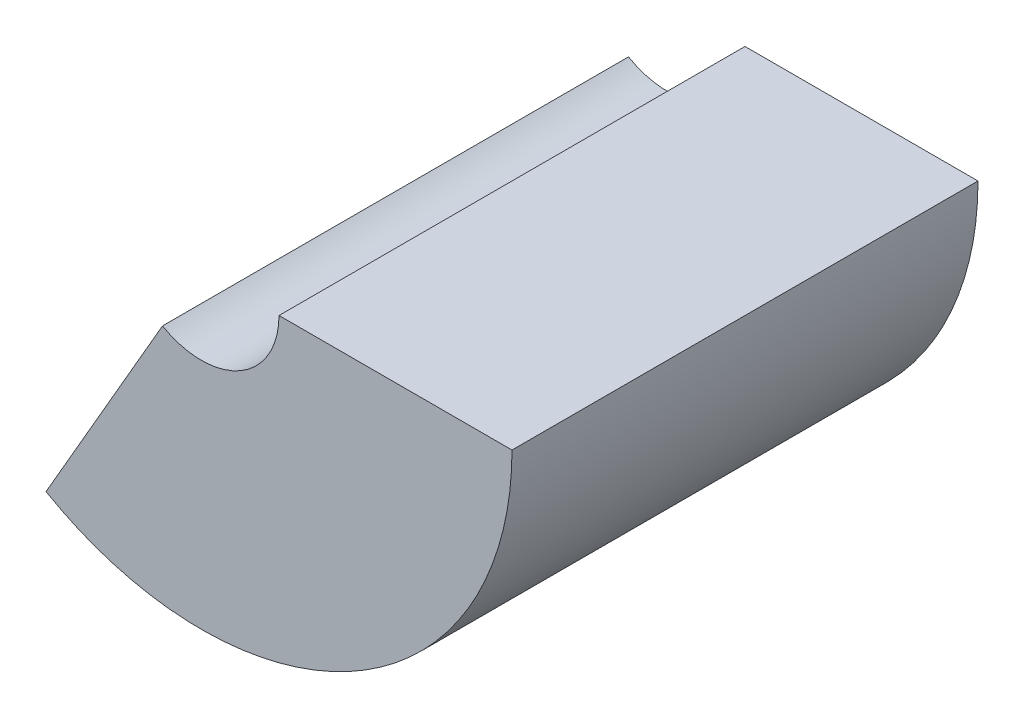
ISO-10303-21;
HEADER;
FILE_DESCRIPTION(('STEP AP214'),'2;1');
FILE_NAME('part.step','',(''),(''),'','','');
FILE_SCHEMA(('AUTOMOTIVE_DESIGN { 1 0 10303 214 1 1 1 1 }'));
ENDSEC;
DATA;
#1=APPLICATION_CONTEXT('core data for automotive mechanical design processes');
#2=APPLICATION_PROTOCOL_DEFINITION('international standard','automotive_design',2000,#1);
#3=PRODUCT_CONTEXT('',#1,'mechanical');
#4=PRODUCT('Part','Part','',(#3));
#5=PRODUCT_RELATED_PRODUCT_CATEGORY('part','',(#4));
#6=PRODUCT_DEFINITION_FORMATION('','',#4);
#7=PRODUCT_DEFINITION_CONTEXT('part definition',#1,'design');
#8=PRODUCT_DEFINITION('design','',#6,#7);
#9=PRODUCT_DEFINITION_SHAPE('','',#8);
#10=(LENGTH_UNIT() NAMED_UNIT(*) SI_UNIT(.MILLI.,.METRE.));
#11=(NAMED_UNIT(*) PLANE_ANGLE_UNIT() SI_UNIT($,.RADIAN.));
#12=(NAMED_UNIT(*) SI_UNIT($,.STERADIAN.) SOLID_ANGLE_UNIT());
#13=UNCERTAINTY_MEASURE_WITH_UNIT(LENGTH_MEASURE(1.E-05),#10,'distance_accuracy_value','');
#14=(GEOMETRIC_REPRESENTATION_CONTEXT(3) GLOBAL_UNCERTAINTY_ASSIGNED_CONTEXT((#13)) GLOBAL_UNIT_ASSIGNED_CONTEXT((#10,
#11,#12)) REPRESENTATION_CONTEXT('',''));
#15=CARTESIAN_POINT('',(0.,0.,0.));
#16=DIRECTION('',(0.,0.,1.));
#17=DIRECTION('',(1.,0.,0.));
#18=AXIS2_PLACEMENT_3D('',#15,#16,#17);
#19=CARTESIAN_POINT('',(0.,0.,0.));
#20=DIRECTION('',(0.,0.,1.));
#21=DIRECTION('',(1.,0.,0.));
#22=AXIS2_PLACEMENT_3D('',#19,#20,#21);
#23=CYLINDRICAL_SURFACE('',#22,5.);
#24=CARTESIAN_POINT('',(0.,0.,0.));
#25=DIRECTION('',(0.,0.,1.));
#26=DIRECTION('',(1.,0.,0.));
#27=AXIS2_PLACEMENT_3D('',#24,#25,#26);
#28=CIRCLE('',#27,5.);
#29=CARTESIAN_POINT('',(-2.5,-4.33012701892219,0.));
#30=VERTEX_POINT('',#29);
#31=CARTESIAN_POINT('',(5.,0.,0.));
#32=VERTEX_POINT('',#31);
#33=EDGE_CURVE('E11',#30,#32,#28,.T.);
#34=ORIENTED_EDGE('',*,*,#33,.T.);
#35=DIRECTION('',(0.,0.,1.));
#36=VECTOR('',#35,1.);
#37=CARTESIAN_POINT('',(5.,0.,-30.));
#38=LINE('',#37,#36);
#39=CARTESIAN_POINT('',(5.,0.,-30.));
#40=VERTEX_POINT('',#39);
#41=EDGE_CURVE('E81',#40,#32,#38,.T.);
#42=ORIENTED_EDGE('',*,*,#41,.F.);
#43=CARTESIAN_POINT('',(0.,0.,-30.));
#44=DIRECTION('',(0.,0.,1.));
#45=DIRECTION('',(1.,0.,0.));
#46=AXIS2_PLACEMENT_3D('',#43,#44,#45);
#47=CIRCLE('',#46,5.);
#48=CARTESIAN_POINT('',(-2.5,-4.33012701892219,-30.));
#49=VERTEX_POINT('',#48);
#50=EDGE_CURVE('E56',#49,#40,#47,.T.);
#51=ORIENTED_EDGE('',*,*,#50,.F.);
#52=DIRECTION('',(0.,0.,1.));
#53=VECTOR('',#52,1.);
#54=CARTESIAN_POINT('',(-2.5,-4.33012701892219,-30.));
#55=LINE('',#54,#53);
#56=EDGE_CURVE('E83',#49,#30,#55,.T.);
#57=ORIENTED_EDGE('',*,*,#56,.T.);
#58=EDGE_LOOP('',(#34,#42,#51,#57));
#59=FACE_BOUND('',#58,.T.);
#60=ADVANCED_FACE('F41',(#59),#23,.F.);
#61=CARTESIAN_POINT('',(-2.5,-4.33012701892219,0.));
#62=DIRECTION('',(0.,0.,1.));
#63=DIRECTION('',(1.,0.,0.));
#64=AXIS2_PLACEMENT_3D('',#61,#62,#63);
#65=PLANE('',#64);
#66=CARTESIAN_POINT('',(0.,0.,0.));
#67=DIRECTION('',(0.,0.,1.));
#68=DIRECTION('',(1.,0.,0.));
#69=AXIS2_PLACEMENT_3D('',#66,#67,#68);
#70=CIRCLE('',#69,20.);
#71=CARTESIAN_POINT('',(-9.99999999999999,-17.3205080756888,0.));
#72=VERTEX_POINT('',#71);
#73=CARTESIAN_POINT('',(20.,0.,0.));
#74=VERTEX_POINT('',#73);
#75=EDGE_CURVE('E49',#72,#74,#70,.T.);
#76=ORIENTED_EDGE('',*,*,#75,.T.);
#77=DIRECTION('',(1.,0.,0.));
#78=VECTOR('',#77,1.);
#79=CARTESIAN_POINT('',(5.,0.,0.));
#80=LINE('',#79,#78);
#81=EDGE_CURVE('E92',#32,#74,#80,.T.);
#82=ORIENTED_EDGE('',*,*,#81,.F.);
#83=ORIENTED_EDGE('',*,*,#33,.F.);
#84=DIRECTION('',(-0.5,-0.866025403784439,0.));
#85=VECTOR('',#84,1.);
#86=CARTESIAN_POINT('',(-2.5,-4.33012701892219,0.));
#87=LINE('',#86,#85);
#88=EDGE_CURVE('E102',#30,#72,#87,.T.);
#89=ORIENTED_EDGE('',*,*,#88,.T.);
#90=EDGE_LOOP('',(#76,#82,#83,#89));
#91=FACE_BOUND('',#90,.T.);
#92=ADVANCED_FACE('F43',(#91),#65,.T.);
#93=CARTESIAN_POINT('',(0.,0.,0.));
#94=DIRECTION('',(0.,0.,1.));
#95=DIRECTION('',(1.,0.,0.));
#96=AXIS2_PLACEMENT_3D('',#93,#94,#95);
#97=CYLINDRICAL_SURFACE('',#96,20.);
#98=CARTESIAN_POINT('',(0.,0.,-30.));
#99=DIRECTION('',(0.,0.,1.));
#100=DIRECTION('',(1.,0.,0.));
#101=AXIS2_PLACEMENT_3D('',#98,#99,#100);
#102=CIRCLE('',#101,20.);
#103=CARTESIAN_POINT('',(-9.99999999999999,-17.3205080756888,-30.));
#104=VERTEX_POINT('',#103);
#105=CARTESIAN_POINT('',(20.,0.,-30.));
#106=VERTEX_POINT('',#105);
#107=EDGE_CURVE('E64',#104,#106,#102,.T.);
#108=ORIENTED_EDGE('',*,*,#107,.T.);
#109=DIRECTION('',(0.,0.,-1.));
#110=VECTOR('',#109,1.);
#111=CARTESIAN_POINT('',(20.,0.,0.));
#112=LINE('',#111,#110);
#113=EDGE_CURVE('E96',#74,#106,#112,.T.);
#114=ORIENTED_EDGE('',*,*,#113,.F.);
#115=ORIENTED_EDGE('',*,*,#75,.F.);
#116=DIRECTION('',(0.,0.,-1.));
#117=VECTOR('',#116,1.);
#118=CARTESIAN_POINT('',(-9.99999999999999,-17.3205080756888,0.));
#119=LINE('',#118,#117);
#120=EDGE_CURVE('E104',#72,#104,#119,.T.);
#121=ORIENTED_EDGE('',*,*,#120,.T.);
#122=EDGE_LOOP('',(#108,#114,#115,#121));
#123=FACE_BOUND('',#122,.T.);
#124=ADVANCED_FACE('F110',(#123),#97,.T.);
#125=CARTESIAN_POINT('',(-9.99999999999999,-17.3205080756888,-30.));
#126=DIRECTION('',(0.,0.,-1.));
#127=DIRECTION('',(-1.,0.,0.));
#128=AXIS2_PLACEMENT_3D('',#125,#126,#127);
#129=PLANE('',#128);
#130=DIRECTION('',(0.5,0.866025403784439,0.));
#131=VECTOR('',#130,1.);
#132=CARTESIAN_POINT('',(-9.99999999999999,-17.3205080756888,-30.));
#133=LINE('',#132,#131);
#134=EDGE_CURVE('E106',#104,#49,#133,.T.);
#135=ORIENTED_EDGE('',*,*,#134,.T.);
#136=ORIENTED_EDGE('',*,*,#50,.T.);
#137=DIRECTION('',(-1.,0.,0.));
#138=VECTOR('',#137,1.);
#139=CARTESIAN_POINT('',(20.,0.,-30.));
#140=LINE('',#139,#138);
#141=EDGE_CURVE('E94',#106,#40,#140,.T.);
#142=ORIENTED_EDGE('',*,*,#141,.F.);
#143=ORIENTED_EDGE('',*,*,#107,.F.);
#144=EDGE_LOOP('',(#135,#136,#142,#143));
#145=FACE_BOUND('',#144,.T.);
#146=ADVANCED_FACE('F113',(#145),#129,.T.);
#147=CARTESIAN_POINT('',(0.,0.,0.));
#148=DIRECTION('',(0.866025403784439,-0.5,0.));
#149=DIRECTION('',(0.,0.,1.));
#150=AXIS2_PLACEMENT_3D('',#147,#148,#149);
#151=PLANE('',#150);
#152=ORIENTED_EDGE('',*,*,#56,.F.);
#153=ORIENTED_EDGE('',*,*,#134,.F.);
#154=ORIENTED_EDGE('',*,*,#120,.F.);
#155=ORIENTED_EDGE('',*,*,#88,.F.);
#156=EDGE_LOOP('',(#152,#153,#154,#155));
#157=FACE_BOUND('',#156,.T.);
#158=ADVANCED_FACE('F115',(#157),#151,.F.);
#159=CARTESIAN_POINT('',(0.,0.,0.));
#160=DIRECTION('',(0.,1.,0.));
#161=DIRECTION('',(0.,0.,1.));
#162=AXIS2_PLACEMENT_3D('',#159,#160,#161);
#163=PLANE('',#162);
#164=ORIENTED_EDGE('',*,*,#41,.T.);
#165=ORIENTED_EDGE('',*,*,#81,.T.);
#166=ORIENTED_EDGE('',*,*,#113,.T.);
#167=ORIENTED_EDGE('',*,*,#141,.T.);
#168=EDGE_LOOP('',(#164,#165,#166,#167));
#169=FACE_BOUND('',#168,.T.);
#170=ADVANCED_FACE('F90',(#169),#163,.T.);
#171=CLOSED_SHELL('',(#60,#92,#124,#146,#158,#170));
#172=MANIFOLD_SOLID_BREP('B2',#171);
#173=ADVANCED_BREP_SHAPE_REPRESENTATION('',(#18,#172),#14);
#174=SHAPE_DEFINITION_REPRESENTATION(#9,#173);
ENDSEC;
END-ISO-10303-21;
